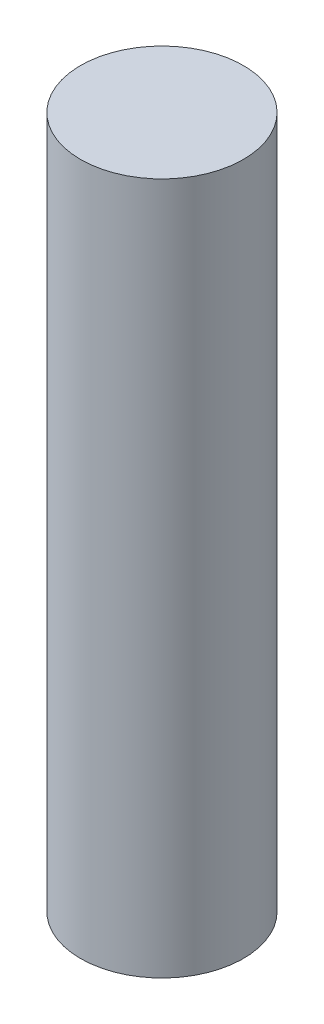
ISO-10303-21;
HEADER;
FILE_DESCRIPTION(('STEP AP214'),'2;1');
FILE_NAME('part.step','',(''),(''),'','','');
FILE_SCHEMA(('AUTOMOTIVE_DESIGN { 1 0 10303 214 1 1 1 1 }'));
ENDSEC;
DATA;
#1=APPLICATION_CONTEXT('core data for automotive mechanical design processes');
#2=APPLICATION_PROTOCOL_DEFINITION('international standard','automotive_design',2000,#1);
#3=PRODUCT_CONTEXT('',#1,'mechanical');
#4=PRODUCT('Part','Part','',(#3));
#5=PRODUCT_RELATED_PRODUCT_CATEGORY('part','',(#4));
#6=PRODUCT_DEFINITION_FORMATION('','',#4);
#7=PRODUCT_DEFINITION_CONTEXT('part definition',#1,'design');
#8=PRODUCT_DEFINITION('design','',#6,#7);
#9=PRODUCT_DEFINITION_SHAPE('','',#8);
#10=(LENGTH_UNIT() NAMED_UNIT(*) SI_UNIT(.MILLI.,.METRE.));
#11=(NAMED_UNIT(*) PLANE_ANGLE_UNIT() SI_UNIT($,.RADIAN.));
#12=(NAMED_UNIT(*) SI_UNIT($,.STERADIAN.) SOLID_ANGLE_UNIT());
#13=UNCERTAINTY_MEASURE_WITH_UNIT(LENGTH_MEASURE(1.E-05),#10,'distance_accuracy_value','');
#14=(GEOMETRIC_REPRESENTATION_CONTEXT(3) GLOBAL_UNCERTAINTY_ASSIGNED_CONTEXT((#13)) GLOBAL_UNIT_ASSIGNED_CONTEXT((#10,
#11,#12)) REPRESENTATION_CONTEXT('',''));
#15=CARTESIAN_POINT('',(0.,0.,0.));
#16=DIRECTION('',(0.,0.,1.));
#17=DIRECTION('',(1.,0.,0.));
#18=AXIS2_PLACEMENT_3D('',#15,#16,#17);
#19=CARTESIAN_POINT('',(0.,85.,0.));
#20=DIRECTION('',(0.,-1.,0.));
#21=DIRECTION('',(0.,0.,-1.));
#22=AXIS2_PLACEMENT_3D('',#19,#20,#21);
#23=CYLINDRICAL_SURFACE('',#22,10.);
#24=CARTESIAN_POINT('',(0.,85.,0.));
#25=DIRECTION('',(0.,1.,0.));
#26=DIRECTION('',(0.,0.,1.));
#27=AXIS2_PLACEMENT_3D('',#24,#25,#26);
#28=CIRCLE('',#27,10.);
#29=CARTESIAN_POINT('',(0.,85.,10.));
#30=VERTEX_POINT('',#29);
#31=EDGE_CURVE('E12',#30,#30,#28,.T.);
#32=ORIENTED_EDGE('',*,*,#31,.F.);
#33=EDGE_LOOP('',(#32));
#34=FACE_BOUND('',#33,.T.);
#35=CARTESIAN_POINT('',(0.,0.,0.));
#36=DIRECTION('',(0.,1.,0.));
#37=DIRECTION('',(0.,0.,1.));
#38=AXIS2_PLACEMENT_3D('',#35,#36,#37);
#39=CIRCLE('',#38,10.);
#40=CARTESIAN_POINT('',(0.,0.,10.));
#41=VERTEX_POINT('',#40);
#42=EDGE_CURVE('E43',#41,#41,#39,.T.);
#43=ORIENTED_EDGE('',*,*,#42,.T.);
#44=EDGE_LOOP('',(#43));
#45=FACE_BOUND('',#44,.T.);
#46=ADVANCED_FACE('F40',(#34,#45),#23,.T.);
#47=CARTESIAN_POINT('',(0.,85.,0.));
#48=DIRECTION('',(0.,1.,0.));
#49=DIRECTION('',(0.,0.,1.));
#50=AXIS2_PLACEMENT_3D('',#47,#48,#49);
#51=PLANE('',#50);
#52=ORIENTED_EDGE('',*,*,#31,.T.);
#53=EDGE_LOOP('',(#52));
#54=FACE_BOUND('',#53,.T.);
#55=ADVANCED_FACE('F55',(#54),#51,.T.);
#56=CARTESIAN_POINT('',(0.,0.,0.));
#57=DIRECTION('',(0.,1.,0.));
#58=DIRECTION('',(0.,0.,1.));
#59=AXIS2_PLACEMENT_3D('',#56,#57,#58);
#60=PLANE('',#59);
#61=ORIENTED_EDGE('',*,*,#42,.F.);
#62=EDGE_LOOP('',(#61));
#63=FACE_BOUND('',#62,.T.);
#64=ADVANCED_FACE('F53',(#63),#60,.F.);
#65=CLOSED_SHELL('',(#46,#55,#64));
#66=MANIFOLD_SOLID_BREP('B2',#65);
#67=ADVANCED_BREP_SHAPE_REPRESENTATION('',(#18,#66),#14);
#68=SHAPE_DEFINITION_REPRESENTATION(#9,#67);
ENDSEC;
END-ISO-10303-21;
